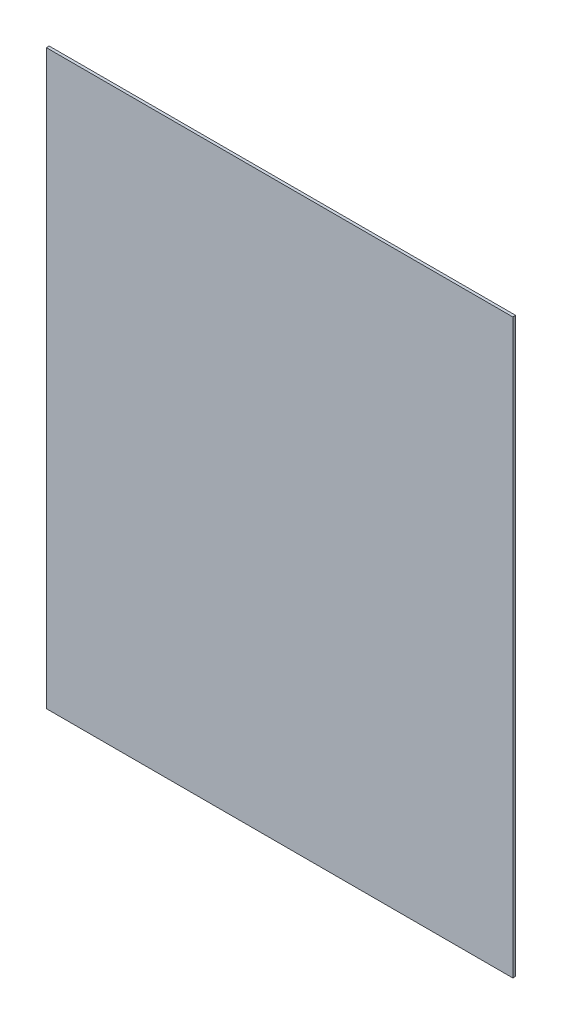
ISO-10303-21;
HEADER;
FILE_DESCRIPTION(('STEP AP214'),'2;1');
FILE_NAME('part.step','',(''),(''),'','','');
FILE_SCHEMA(('AUTOMOTIVE_DESIGN { 1 0 10303 214 1 1 1 1 }'));
ENDSEC;
DATA;
#1=APPLICATION_CONTEXT('core data for automotive mechanical design processes');
#2=APPLICATION_PROTOCOL_DEFINITION('international standard','automotive_design',2000,#1);
#3=PRODUCT_CONTEXT('',#1,'mechanical');
#4=PRODUCT('Part','Part','',(#3));
#5=PRODUCT_RELATED_PRODUCT_CATEGORY('part','',(#4));
#6=PRODUCT_DEFINITION_FORMATION('','',#4);
#7=PRODUCT_DEFINITION_CONTEXT('part definition',#1,'design');
#8=PRODUCT_DEFINITION('design','',#6,#7);
#9=PRODUCT_DEFINITION_SHAPE('','',#8);
#10=(LENGTH_UNIT() NAMED_UNIT(*) SI_UNIT(.MILLI.,.METRE.));
#11=(NAMED_UNIT(*) PLANE_ANGLE_UNIT() SI_UNIT($,.RADIAN.));
#12=(NAMED_UNIT(*) SI_UNIT($,.STERADIAN.) SOLID_ANGLE_UNIT());
#13=UNCERTAINTY_MEASURE_WITH_UNIT(LENGTH_MEASURE(1.E-05),#10,'distance_accuracy_value','');
#14=(GEOMETRIC_REPRESENTATION_CONTEXT(3) GLOBAL_UNCERTAINTY_ASSIGNED_CONTEXT((#13)) GLOBAL_UNIT_ASSIGNED_CONTEXT((#10,
#11,#12)) REPRESENTATION_CONTEXT('',''));
#15=CARTESIAN_POINT('',(0.,0.,0.));
#16=DIRECTION('',(0.,0.,1.));
#17=DIRECTION('',(1.,0.,0.));
#18=AXIS2_PLACEMENT_3D('',#15,#16,#17);
#19=CARTESIAN_POINT('',(-0.825,-1.,0.01));
#20=DIRECTION('',(1.,0.,0.));
#21=DIRECTION('',(0.,0.,-1.));
#22=AXIS2_PLACEMENT_3D('',#19,#20,#21);
#23=PLANE('',#22);
#24=DIRECTION('',(0.,-1.,0.));
#25=VECTOR('',#24,1.);
#26=CARTESIAN_POINT('',(-0.825,-1.,0.));
#27=LINE('',#26,#25);
#28=CARTESIAN_POINT('',(-0.825,1.025,0.));
#29=VERTEX_POINT('',#28);
#30=CARTESIAN_POINT('',(-0.825,-1.,0.));
#31=VERTEX_POINT('',#30);
#32=EDGE_CURVE('E99',#29,#31,#27,.T.);
#33=ORIENTED_EDGE('',*,*,#32,.T.);
#34=DIRECTION('',(0.,0.,-1.));
#35=VECTOR('',#34,1.);
#36=CARTESIAN_POINT('',(-0.825,-1.,0.01));
#37=LINE('',#36,#35);
#38=CARTESIAN_POINT('',(-0.825,-1.,0.01));
#39=VERTEX_POINT('',#38);
#40=EDGE_CURVE('E11',#39,#31,#37,.T.);
#41=ORIENTED_EDGE('',*,*,#40,.F.);
#42=DIRECTION('',(0.,-1.,0.));
#43=VECTOR('',#42,1.);
#44=CARTESIAN_POINT('',(-0.825,-1.,0.01));
#45=LINE('',#44,#43);
#46=CARTESIAN_POINT('',(-0.825,1.025,0.01));
#47=VERTEX_POINT('',#46);
#48=EDGE_CURVE('E87',#47,#39,#45,.T.);
#49=ORIENTED_EDGE('',*,*,#48,.F.);
#50=DIRECTION('',(0.,0.,-1.));
#51=VECTOR('',#50,1.);
#52=CARTESIAN_POINT('',(-0.825,1.025,0.01));
#53=LINE('',#52,#51);
#54=EDGE_CURVE('E95',#47,#29,#53,.T.);
#55=ORIENTED_EDGE('',*,*,#54,.T.);
#56=EDGE_LOOP('',(#33,#41,#49,#55));
#57=FACE_BOUND('',#56,.T.);
#58=ADVANCED_FACE('F36',(#57),#23,.F.);
#59=CARTESIAN_POINT('',(0.825,-1.,0.01));
#60=DIRECTION('',(0.,1.,0.));
#61=DIRECTION('',(0.,0.,1.));
#62=AXIS2_PLACEMENT_3D('',#59,#60,#61);
#63=PLANE('',#62);
#64=DIRECTION('',(1.,0.,0.));
#65=VECTOR('',#64,1.);
#66=CARTESIAN_POINT('',(0.825,-1.,0.));
#67=LINE('',#66,#65);
#68=CARTESIAN_POINT('',(0.825,-1.,0.));
#69=VERTEX_POINT('',#68);
#70=EDGE_CURVE('E91',#31,#69,#67,.T.);
#71=ORIENTED_EDGE('',*,*,#70,.T.);
#72=DIRECTION('',(0.,0.,-1.));
#73=VECTOR('',#72,1.);
#74=CARTESIAN_POINT('',(0.825,-1.,0.01));
#75=LINE('',#74,#73);
#76=CARTESIAN_POINT('',(0.825,-1.,0.01));
#77=VERTEX_POINT('',#76);
#78=EDGE_CURVE('E44',#77,#69,#75,.T.);
#79=ORIENTED_EDGE('',*,*,#78,.F.);
#80=DIRECTION('',(1.,0.,0.));
#81=VECTOR('',#80,1.);
#82=CARTESIAN_POINT('',(0.825,-1.,0.01));
#83=LINE('',#82,#81);
#84=EDGE_CURVE('E82',#39,#77,#83,.T.);
#85=ORIENTED_EDGE('',*,*,#84,.F.);
#86=ORIENTED_EDGE('',*,*,#40,.T.);
#87=EDGE_LOOP('',(#71,#79,#85,#86));
#88=FACE_BOUND('',#87,.T.);
#89=ADVANCED_FACE('F90',(#88),#63,.F.);
#90=CARTESIAN_POINT('',(0.825,1.025,0.01));
#91=DIRECTION('',(-1.,0.,0.));
#92=DIRECTION('',(0.,0.,1.));
#93=AXIS2_PLACEMENT_3D('',#90,#91,#92);
#94=PLANE('',#93);
#95=DIRECTION('',(0.,1.,0.));
#96=VECTOR('',#95,1.);
#97=CARTESIAN_POINT('',(0.825,1.025,0.));
#98=LINE('',#97,#96);
#99=CARTESIAN_POINT('',(0.825,1.025,0.));
#100=VERTEX_POINT('',#99);
#101=EDGE_CURVE('E69',#69,#100,#98,.T.);
#102=ORIENTED_EDGE('',*,*,#101,.T.);
#103=DIRECTION('',(0.,0.,-1.));
#104=VECTOR('',#103,1.);
#105=CARTESIAN_POINT('',(0.825,1.025,0.01));
#106=LINE('',#105,#104);
#107=CARTESIAN_POINT('',(0.825,1.025,0.01));
#108=VERTEX_POINT('',#107);
#109=EDGE_CURVE('E92',#108,#100,#106,.T.);
#110=ORIENTED_EDGE('',*,*,#109,.F.);
#111=DIRECTION('',(0.,1.,0.));
#112=VECTOR('',#111,1.);
#113=CARTESIAN_POINT('',(0.825,1.025,0.01));
#114=LINE('',#113,#112);
#115=EDGE_CURVE('E85',#77,#108,#114,.T.);
#116=ORIENTED_EDGE('',*,*,#115,.F.);
#117=ORIENTED_EDGE('',*,*,#78,.T.);
#118=EDGE_LOOP('',(#102,#110,#116,#117));
#119=FACE_BOUND('',#118,.T.);
#120=ADVANCED_FACE('F93',(#119),#94,.F.);
#121=CARTESIAN_POINT('',(-0.825,1.025,0.01));
#122=DIRECTION('',(0.,-1.,0.));
#123=DIRECTION('',(0.,0.,-1.));
#124=AXIS2_PLACEMENT_3D('',#121,#122,#123);
#125=PLANE('',#124);
#126=DIRECTION('',(-1.,0.,0.));
#127=VECTOR('',#126,1.);
#128=CARTESIAN_POINT('',(-0.825,1.025,0.));
#129=LINE('',#128,#127);
#130=EDGE_CURVE('E75',#100,#29,#129,.T.);
#131=ORIENTED_EDGE('',*,*,#130,.T.);
#132=ORIENTED_EDGE('',*,*,#54,.F.);
#133=DIRECTION('',(-1.,0.,0.));
#134=VECTOR('',#133,1.);
#135=CARTESIAN_POINT('',(-0.825,1.025,0.01));
#136=LINE('',#135,#134);
#137=EDGE_CURVE('E52',#108,#47,#136,.T.);
#138=ORIENTED_EDGE('',*,*,#137,.F.);
#139=ORIENTED_EDGE('',*,*,#109,.T.);
#140=EDGE_LOOP('',(#131,#132,#138,#139));
#141=FACE_BOUND('',#140,.T.);
#142=ADVANCED_FACE('F106',(#141),#125,.F.);
#143=CARTESIAN_POINT('',(0.,0.,0.01));
#144=DIRECTION('',(0.,0.,-1.));
#145=DIRECTION('',(-1.,0.,0.));
#146=AXIS2_PLACEMENT_3D('',#143,#144,#145);
#147=PLANE('',#146);
#148=ORIENTED_EDGE('',*,*,#48,.T.);
#149=ORIENTED_EDGE('',*,*,#84,.T.);
#150=ORIENTED_EDGE('',*,*,#115,.T.);
#151=ORIENTED_EDGE('',*,*,#137,.T.);
#152=EDGE_LOOP('',(#148,#149,#150,#151));
#153=FACE_BOUND('',#152,.T.);
#154=ADVANCED_FACE('F83',(#153),#147,.F.);
#155=CARTESIAN_POINT('',(0.,0.,0.));
#156=DIRECTION('',(0.,0.,-1.));
#157=DIRECTION('',(-1.,0.,0.));
#158=AXIS2_PLACEMENT_3D('',#155,#156,#157);
#159=PLANE('',#158);
#160=ORIENTED_EDGE('',*,*,#32,.F.);
#161=ORIENTED_EDGE('',*,*,#130,.F.);
#162=ORIENTED_EDGE('',*,*,#101,.F.);
#163=ORIENTED_EDGE('',*,*,#70,.F.);
#164=EDGE_LOOP('',(#160,#161,#162,#163));
#165=FACE_BOUND('',#164,.T.);
#166=ADVANCED_FACE('F109',(#165),#159,.T.);
#167=CLOSED_SHELL('',(#58,#89,#120,#142,#154,#166));
#168=MANIFOLD_SOLID_BREP('B2',#167);
#169=ADVANCED_BREP_SHAPE_REPRESENTATION('',(#18,#168),#14);
#170=SHAPE_DEFINITION_REPRESENTATION(#9,#169);
ENDSEC;
END-ISO-10303-21;
